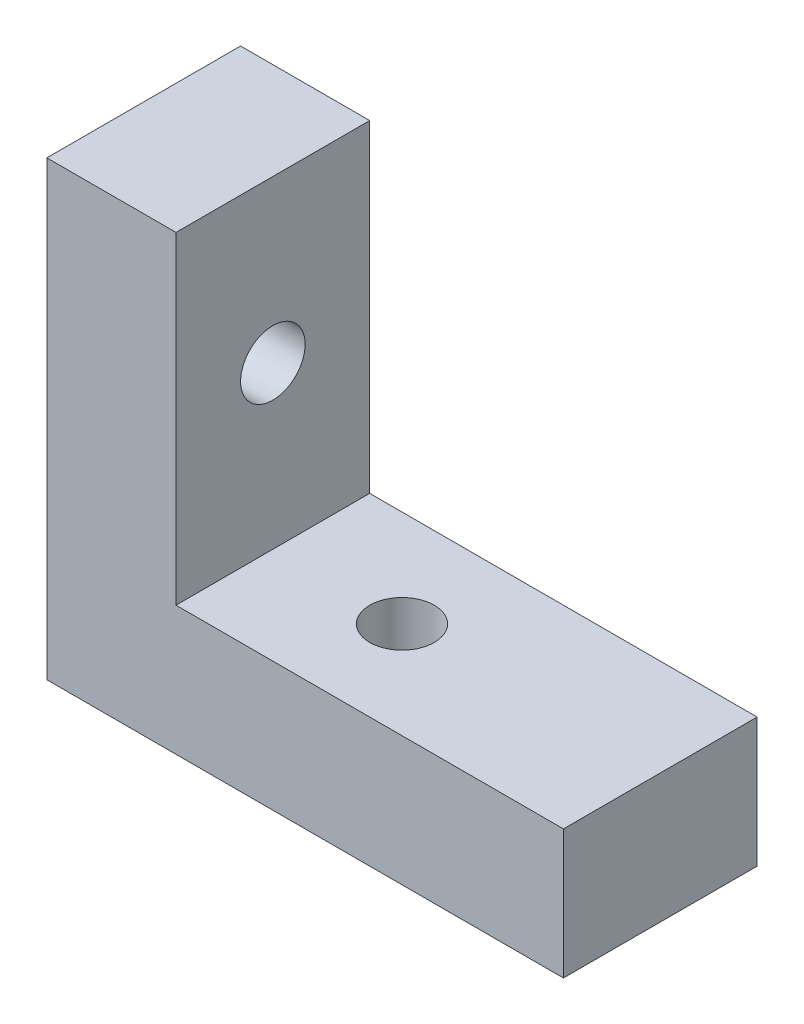
ISO-10303-21;
HEADER;
FILE_DESCRIPTION(('STEP AP214'),'2;1');
FILE_NAME('part.step','',(''),(''),'','','');
FILE_SCHEMA(('AUTOMOTIVE_DESIGN { 1 0 10303 214 1 1 1 1 }'));
ENDSEC;
DATA;
#1=APPLICATION_CONTEXT('core data for automotive mechanical design processes');
#2=APPLICATION_PROTOCOL_DEFINITION('international standard','automotive_design',2000,#1);
#3=PRODUCT_CONTEXT('',#1,'mechanical');
#4=PRODUCT('Part','Part','',(#3));
#5=PRODUCT_RELATED_PRODUCT_CATEGORY('part','',(#4));
#6=PRODUCT_DEFINITION_FORMATION('','',#4);
#7=PRODUCT_DEFINITION_CONTEXT('part definition',#1,'design');
#8=PRODUCT_DEFINITION('design','',#6,#7);
#9=PRODUCT_DEFINITION_SHAPE('','',#8);
#10=(LENGTH_UNIT() NAMED_UNIT(*) SI_UNIT(.MILLI.,.METRE.));
#11=(NAMED_UNIT(*) PLANE_ANGLE_UNIT() SI_UNIT($,.RADIAN.));
#12=(NAMED_UNIT(*) SI_UNIT($,.STERADIAN.) SOLID_ANGLE_UNIT());
#13=UNCERTAINTY_MEASURE_WITH_UNIT(LENGTH_MEASURE(1.E-05),#10,'distance_accuracy_value','');
#14=(GEOMETRIC_REPRESENTATION_CONTEXT(3) GLOBAL_UNCERTAINTY_ASSIGNED_CONTEXT((#13)) GLOBAL_UNIT_ASSIGNED_CONTEXT((#10,
#11,#12)) REPRESENTATION_CONTEXT('',''));
#15=CARTESIAN_POINT('',(0.,0.,0.));
#16=DIRECTION('',(0.,0.,1.));
#17=DIRECTION('',(1.,0.,0.));
#18=AXIS2_PLACEMENT_3D('',#15,#16,#17);
#19=CARTESIAN_POINT('',(0.,20.,0.));
#20=DIRECTION('',(0.,-1.,0.));
#21=DIRECTION('',(0.,0.,-1.));
#22=AXIS2_PLACEMENT_3D('',#19,#20,#21);
#23=PLANE('',#22);
#24=CARTESIAN_POINT('',(0.,20.,0.));
#25=DIRECTION('',(0.,1.,0.));
#26=DIRECTION('',(0.,0.,1.));
#27=AXIS2_PLACEMENT_3D('',#24,#25,#26);
#28=CIRCLE('',#27,5.);
#29=CARTESIAN_POINT('',(0.,20.,5.));
#30=VERTEX_POINT('',#29);
#31=EDGE_CURVE('E249',#30,#30,#28,.T.);
#32=ORIENTED_EDGE('',*,*,#31,.F.);
#33=EDGE_LOOP('',(#32));
#34=FACE_BOUND('',#33,.T.);
#35=DIRECTION('',(0.,0.,-1.));
#36=VECTOR('',#35,1.);
#37=CARTESIAN_POINT('',(-20.,20.,15.));
#38=LINE('',#37,#36);
#39=CARTESIAN_POINT('',(-20.,20.,15.));
#40=VERTEX_POINT('',#39);
#41=CARTESIAN_POINT('',(-20.,20.,-15.));
#42=VERTEX_POINT('',#41);
#43=EDGE_CURVE('E52',#40,#42,#38,.T.);
#44=ORIENTED_EDGE('',*,*,#43,.F.);
#45=DIRECTION('',(1.,0.,0.));
#46=VECTOR('',#45,1.);
#47=CARTESIAN_POINT('',(-40.,20.,15.));
#48=LINE('',#47,#46);
#49=CARTESIAN_POINT('',(40.,20.,15.));
#50=VERTEX_POINT('',#49);
#51=EDGE_CURVE('E57',#40,#50,#48,.T.);
#52=ORIENTED_EDGE('',*,*,#51,.T.);
#53=DIRECTION('',(0.,0.,-1.));
#54=VECTOR('',#53,1.);
#55=CARTESIAN_POINT('',(40.,20.,15.));
#56=LINE('',#55,#54);
#57=CARTESIAN_POINT('',(40.,20.,-15.));
#58=VERTEX_POINT('',#57);
#59=EDGE_CURVE('E88',#50,#58,#56,.T.);
#60=ORIENTED_EDGE('',*,*,#59,.T.);
#61=DIRECTION('',(-1.,0.,0.));
#62=VECTOR('',#61,1.);
#63=CARTESIAN_POINT('',(-40.,20.,-15.));
#64=LINE('',#63,#62);
#65=EDGE_CURVE('E145',#58,#42,#64,.T.);
#66=ORIENTED_EDGE('',*,*,#65,.T.);
#67=EDGE_LOOP('',(#44,#52,#60,#66));
#68=FACE_BOUND('',#67,.T.);
#69=ADVANCED_FACE('F36',(#34,#68),#23,.F.);
#70=CARTESIAN_POINT('',(40.,20.,15.));
#71=DIRECTION('',(-1.,0.,0.));
#72=DIRECTION('',(0.,0.,1.));
#73=AXIS2_PLACEMENT_3D('',#70,#71,#72);
#74=PLANE('',#73);
#75=DIRECTION('',(0.,0.,-1.));
#76=VECTOR('',#75,1.);
#77=CARTESIAN_POINT('',(40.,0.,15.));
#78=LINE('',#77,#76);
#79=CARTESIAN_POINT('',(40.,0.,15.));
#80=VERTEX_POINT('',#79);
#81=CARTESIAN_POINT('',(40.,0.,-15.));
#82=VERTEX_POINT('',#81);
#83=EDGE_CURVE('E94',#80,#82,#78,.T.);
#84=ORIENTED_EDGE('',*,*,#83,.T.);
#85=DIRECTION('',(0.,-1.,0.));
#86=VECTOR('',#85,1.);
#87=CARTESIAN_POINT('',(40.,20.,-15.));
#88=LINE('',#87,#86);
#89=EDGE_CURVE('E11',#58,#82,#88,.T.);
#90=ORIENTED_EDGE('',*,*,#89,.F.);
#91=ORIENTED_EDGE('',*,*,#59,.F.);
#92=DIRECTION('',(0.,-1.,0.));
#93=VECTOR('',#92,1.);
#94=CARTESIAN_POINT('',(40.,20.,15.));
#95=LINE('',#94,#93);
#96=EDGE_CURVE('E80',#50,#80,#95,.T.);
#97=ORIENTED_EDGE('',*,*,#96,.T.);
#98=EDGE_LOOP('',(#84,#90,#91,#97));
#99=FACE_BOUND('',#98,.T.);
#100=ADVANCED_FACE('F38',(#99),#74,.F.);
#101=CARTESIAN_POINT('',(-40.,20.,-15.));
#102=DIRECTION('',(0.,0.,1.));
#103=DIRECTION('',(1.,0.,0.));
#104=AXIS2_PLACEMENT_3D('',#101,#102,#103);
#105=PLANE('',#104);
#106=DIRECTION('',(-1.,0.,0.));
#107=VECTOR('',#106,1.);
#108=CARTESIAN_POINT('',(-40.,0.,-15.));
#109=LINE('',#108,#107);
#110=CARTESIAN_POINT('',(-40.,0.,-15.));
#111=VERTEX_POINT('',#110);
#112=EDGE_CURVE('E97',#82,#111,#109,.T.);
#113=ORIENTED_EDGE('',*,*,#112,.T.);
#114=DIRECTION('',(0.,-1.,0.));
#115=VECTOR('',#114,1.);
#116=CARTESIAN_POINT('',(-40.,20.,-15.));
#117=LINE('',#116,#115);
#118=CARTESIAN_POINT('',(-40.,70.,-15.));
#119=VERTEX_POINT('',#118);
#120=EDGE_CURVE('E45',#119,#111,#117,.T.);
#121=ORIENTED_EDGE('',*,*,#120,.F.);
#122=DIRECTION('',(-1.,0.,0.));
#123=VECTOR('',#122,1.);
#124=CARTESIAN_POINT('',(-20.,70.,-15.));
#125=LINE('',#124,#123);
#126=CARTESIAN_POINT('',(-20.,70.,-15.));
#127=VERTEX_POINT('',#126);
#128=EDGE_CURVE('E122',#127,#119,#125,.T.);
#129=ORIENTED_EDGE('',*,*,#128,.F.);
#130=DIRECTION('',(0.,-1.,0.));
#131=VECTOR('',#130,1.);
#132=CARTESIAN_POINT('',(-20.,70.,-15.));
#133=LINE('',#132,#131);
#134=EDGE_CURVE('E102',#127,#42,#133,.T.);
#135=ORIENTED_EDGE('',*,*,#134,.T.);
#136=ORIENTED_EDGE('',*,*,#65,.F.);
#137=ORIENTED_EDGE('',*,*,#89,.T.);
#138=EDGE_LOOP('',(#113,#121,#129,#135,#136,#137));
#139=FACE_BOUND('',#138,.T.);
#140=ADVANCED_FACE('F120',(#139),#105,.F.);
#141=CARTESIAN_POINT('',(-40.,20.,15.));
#142=DIRECTION('',(1.,0.,0.));
#143=DIRECTION('',(0.,0.,-1.));
#144=AXIS2_PLACEMENT_3D('',#141,#142,#143);
#145=PLANE('',#144);
#146=CARTESIAN_POINT('',(-40.,45.,0.));
#147=DIRECTION('',(1.,0.,0.));
#148=DIRECTION('',(0.,0.,-1.));
#149=AXIS2_PLACEMENT_3D('',#146,#147,#148);
#150=CIRCLE('',#149,5.);
#151=CARTESIAN_POINT('',(-40.,45.,-5.));
#152=VERTEX_POINT('',#151);
#153=EDGE_CURVE('E248',#152,#152,#150,.T.);
#154=ORIENTED_EDGE('',*,*,#153,.T.);
#155=EDGE_LOOP('',(#154));
#156=FACE_BOUND('',#155,.T.);
#157=DIRECTION('',(0.,0.,1.));
#158=VECTOR('',#157,1.);
#159=CARTESIAN_POINT('',(-40.,0.,15.));
#160=LINE('',#159,#158);
#161=CARTESIAN_POINT('',(-40.,0.,15.));
#162=VERTEX_POINT('',#161);
#163=EDGE_CURVE('E89',#111,#162,#160,.T.);
#164=ORIENTED_EDGE('',*,*,#163,.T.);
#165=DIRECTION('',(0.,-1.,0.));
#166=VECTOR('',#165,1.);
#167=CARTESIAN_POINT('',(-40.,20.,15.));
#168=LINE('',#167,#166);
#169=CARTESIAN_POINT('',(-40.,70.,15.));
#170=VERTEX_POINT('',#169);
#171=EDGE_CURVE('E84',#170,#162,#168,.T.);
#172=ORIENTED_EDGE('',*,*,#171,.F.);
#173=DIRECTION('',(0.,0.,1.));
#174=VECTOR('',#173,1.);
#175=CARTESIAN_POINT('',(-40.,70.,-15.));
#176=LINE('',#175,#174);
#177=EDGE_CURVE('E116',#119,#170,#176,.T.);
#178=ORIENTED_EDGE('',*,*,#177,.F.);
#179=ORIENTED_EDGE('',*,*,#120,.T.);
#180=EDGE_LOOP('',(#164,#172,#178,#179));
#181=FACE_BOUND('',#180,.T.);
#182=ADVANCED_FACE('F113',(#156,#181),#145,.F.);
#183=CARTESIAN_POINT('',(-40.,20.,15.));
#184=DIRECTION('',(0.,0.,-1.));
#185=DIRECTION('',(-1.,0.,0.));
#186=AXIS2_PLACEMENT_3D('',#183,#184,#185);
#187=PLANE('',#186);
#188=DIRECTION('',(1.,0.,0.));
#189=VECTOR('',#188,1.);
#190=CARTESIAN_POINT('',(-40.,0.,15.));
#191=LINE('',#190,#189);
#192=EDGE_CURVE('E77',#162,#80,#191,.T.);
#193=ORIENTED_EDGE('',*,*,#192,.T.);
#194=ORIENTED_EDGE('',*,*,#96,.F.);
#195=ORIENTED_EDGE('',*,*,#51,.F.);
#196=DIRECTION('',(0.,-1.,0.));
#197=VECTOR('',#196,1.);
#198=CARTESIAN_POINT('',(-20.,70.,15.));
#199=LINE('',#198,#197);
#200=CARTESIAN_POINT('',(-20.,70.,15.));
#201=VERTEX_POINT('',#200);
#202=EDGE_CURVE('E98',#201,#40,#199,.T.);
#203=ORIENTED_EDGE('',*,*,#202,.F.);
#204=DIRECTION('',(1.,0.,0.));
#205=VECTOR('',#204,1.);
#206=CARTESIAN_POINT('',(-40.,70.,15.));
#207=LINE('',#206,#205);
#208=EDGE_CURVE('E137',#170,#201,#207,.T.);
#209=ORIENTED_EDGE('',*,*,#208,.F.);
#210=ORIENTED_EDGE('',*,*,#171,.T.);
#211=EDGE_LOOP('',(#193,#194,#195,#203,#209,#210));
#212=FACE_BOUND('',#211,.T.);
#213=ADVANCED_FACE('F79',(#212),#187,.F.);
#214=CARTESIAN_POINT('',(0.,0.,0.));
#215=DIRECTION('',(0.,-1.,0.));
#216=DIRECTION('',(0.,0.,-1.));
#217=AXIS2_PLACEMENT_3D('',#214,#215,#216);
#218=PLANE('',#217);
#219=CARTESIAN_POINT('',(0.,0.,0.));
#220=DIRECTION('',(0.,-1.,0.));
#221=DIRECTION('',(0.,0.,-1.));
#222=AXIS2_PLACEMENT_3D('',#219,#220,#221);
#223=CIRCLE('',#222,5.);
#224=CARTESIAN_POINT('',(0.,0.,-5.));
#225=VERTEX_POINT('',#224);
#226=EDGE_CURVE('E40',#225,#225,#223,.T.);
#227=ORIENTED_EDGE('',*,*,#226,.F.);
#228=EDGE_LOOP('',(#227));
#229=FACE_BOUND('',#228,.T.);
#230=ORIENTED_EDGE('',*,*,#83,.F.);
#231=ORIENTED_EDGE('',*,*,#192,.F.);
#232=ORIENTED_EDGE('',*,*,#163,.F.);
#233=ORIENTED_EDGE('',*,*,#112,.F.);
#234=EDGE_LOOP('',(#230,#231,#232,#233));
#235=FACE_BOUND('',#234,.T.);
#236=ADVANCED_FACE('F96',(#229,#235),#218,.T.);
#237=CARTESIAN_POINT('',(-20.,70.,15.));
#238=DIRECTION('',(-1.,0.,0.));
#239=DIRECTION('',(0.,0.,1.));
#240=AXIS2_PLACEMENT_3D('',#237,#238,#239);
#241=PLANE('',#240);
#242=CARTESIAN_POINT('',(-20.,45.,0.));
#243=DIRECTION('',(1.,0.,0.));
#244=DIRECTION('',(0.,0.,-1.));
#245=AXIS2_PLACEMENT_3D('',#242,#243,#244);
#246=CIRCLE('',#245,5.);
#247=CARTESIAN_POINT('',(-20.,45.,-5.));
#248=VERTEX_POINT('',#247);
#249=EDGE_CURVE('E245',#248,#248,#246,.T.);
#250=ORIENTED_EDGE('',*,*,#249,.F.);
#251=EDGE_LOOP('',(#250));
#252=FACE_BOUND('',#251,.T.);
#253=ORIENTED_EDGE('',*,*,#43,.T.);
#254=ORIENTED_EDGE('',*,*,#134,.F.);
#255=DIRECTION('',(0.,0.,-1.));
#256=VECTOR('',#255,1.);
#257=CARTESIAN_POINT('',(-20.,70.,15.));
#258=LINE('',#257,#256);
#259=EDGE_CURVE('E134',#201,#127,#258,.T.);
#260=ORIENTED_EDGE('',*,*,#259,.F.);
#261=ORIENTED_EDGE('',*,*,#202,.T.);
#262=EDGE_LOOP('',(#253,#254,#260,#261));
#263=FACE_BOUND('',#262,.T.);
#264=ADVANCED_FACE('F141',(#252,#263),#241,.F.);
#265=CARTESIAN_POINT('',(0.,70.,0.));
#266=DIRECTION('',(0.,1.,0.));
#267=DIRECTION('',(0.,0.,1.));
#268=AXIS2_PLACEMENT_3D('',#265,#266,#267);
#269=PLANE('',#268);
#270=ORIENTED_EDGE('',*,*,#128,.T.);
#271=ORIENTED_EDGE('',*,*,#177,.T.);
#272=ORIENTED_EDGE('',*,*,#208,.T.);
#273=ORIENTED_EDGE('',*,*,#259,.T.);
#274=EDGE_LOOP('',(#270,#271,#272,#273));
#275=FACE_BOUND('',#274,.T.);
#276=ADVANCED_FACE('F136',(#275),#269,.T.);
#277=CARTESIAN_POINT('',(0.,-30.,0.));
#278=DIRECTION('',(0.,1.,0.));
#279=DIRECTION('',(0.,0.,1.));
#280=AXIS2_PLACEMENT_3D('',#277,#278,#279);
#281=CYLINDRICAL_SURFACE('',#280,5.);
#282=ORIENTED_EDGE('',*,*,#226,.T.);
#283=EDGE_LOOP('',(#282));
#284=FACE_BOUND('',#283,.T.);
#285=ORIENTED_EDGE('',*,*,#31,.T.);
#286=EDGE_LOOP('',(#285));
#287=FACE_BOUND('',#286,.T.);
#288=ADVANCED_FACE('F194',(#284,#287),#281,.F.);
#289=CARTESIAN_POINT('',(-70.,45.,0.));
#290=DIRECTION('',(1.,0.,0.));
#291=DIRECTION('',(0.,0.,-1.));
#292=AXIS2_PLACEMENT_3D('',#289,#290,#291);
#293=CYLINDRICAL_SURFACE('',#292,5.);
#294=ORIENTED_EDGE('',*,*,#249,.T.);
#295=EDGE_LOOP('',(#294));
#296=FACE_BOUND('',#295,.T.);
#297=ORIENTED_EDGE('',*,*,#153,.F.);
#298=EDGE_LOOP('',(#297));
#299=FACE_BOUND('',#298,.T.);
#300=ADVANCED_FACE('F199',(#296,#299),#293,.F.);
#301=CLOSED_SHELL('',(#69,#100,#140,#182,#213,#236,#264,#276,#288,#300));
#302=MANIFOLD_SOLID_BREP('B2',#301);
#303=ADVANCED_BREP_SHAPE_REPRESENTATION('',(#18,#302),#14);
#304=SHAPE_DEFINITION_REPRESENTATION(#9,#303);
ENDSEC;
END-ISO-10303-21;
